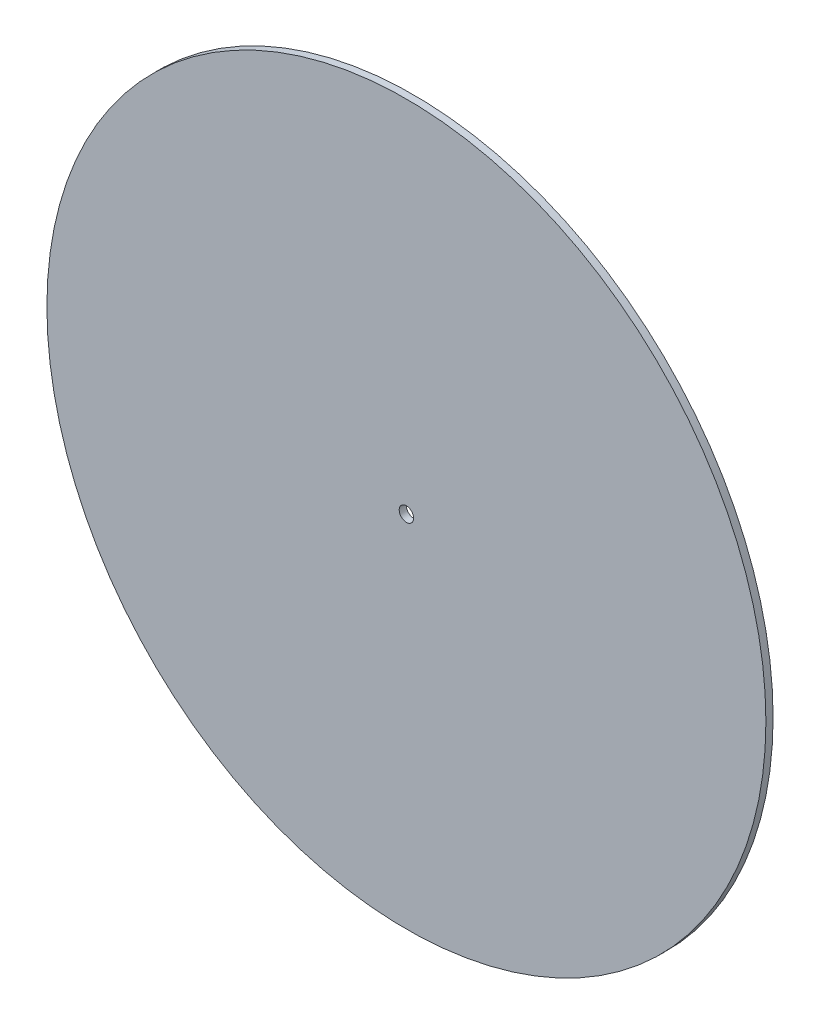
ISO-10303-21;
HEADER;
FILE_DESCRIPTION(('STEP AP214'),'2;1');
FILE_NAME('part.step','',(''),(''),'','','');
FILE_SCHEMA(('AUTOMOTIVE_DESIGN { 1 0 10303 214 1 1 1 1 }'));
ENDSEC;
DATA;
#1=APPLICATION_CONTEXT('core data for automotive mechanical design processes');
#2=APPLICATION_PROTOCOL_DEFINITION('international standard','automotive_design',2000,#1);
#3=PRODUCT_CONTEXT('',#1,'mechanical');
#4=PRODUCT('Part','Part','',(#3));
#5=PRODUCT_RELATED_PRODUCT_CATEGORY('part','',(#4));
#6=PRODUCT_DEFINITION_FORMATION('','',#4);
#7=PRODUCT_DEFINITION_CONTEXT('part definition',#1,'design');
#8=PRODUCT_DEFINITION('design','',#6,#7);
#9=PRODUCT_DEFINITION_SHAPE('','',#8);
#10=(LENGTH_UNIT() NAMED_UNIT(*) SI_UNIT(.MILLI.,.METRE.));
#11=(NAMED_UNIT(*) PLANE_ANGLE_UNIT() SI_UNIT($,.RADIAN.));
#12=(NAMED_UNIT(*) SI_UNIT($,.STERADIAN.) SOLID_ANGLE_UNIT());
#13=UNCERTAINTY_MEASURE_WITH_UNIT(LENGTH_MEASURE(1.E-05),#10,'distance_accuracy_value','');
#14=(GEOMETRIC_REPRESENTATION_CONTEXT(3) GLOBAL_UNCERTAINTY_ASSIGNED_CONTEXT((#13)) GLOBAL_UNIT_ASSIGNED_CONTEXT((#10,
#11,#12)) REPRESENTATION_CONTEXT('',''));
#15=CARTESIAN_POINT('',(0.,0.,0.));
#16=DIRECTION('',(0.,0.,1.));
#17=DIRECTION('',(1.,0.,0.));
#18=AXIS2_PLACEMENT_3D('',#15,#16,#17);
#19=CARTESIAN_POINT('',(0.,0.,2.));
#20=DIRECTION('',(0.,0.,1.));
#21=DIRECTION('',(1.,0.,0.));
#22=AXIS2_PLACEMENT_3D('',#19,#20,#21);
#23=PLANE('',#22);
#24=CARTESIAN_POINT('',(0.,0.,2.));
#25=DIRECTION('',(0.,0.,1.));
#26=DIRECTION('',(1.,0.,0.));
#27=AXIS2_PLACEMENT_3D('',#24,#25,#26);
#28=CIRCLE('',#27,100.);
#29=CARTESIAN_POINT('',(100.,0.,2.));
#30=VERTEX_POINT('',#29);
#31=EDGE_CURVE('E10',#30,#30,#28,.T.);
#32=ORIENTED_EDGE('',*,*,#31,.T.);
#33=EDGE_LOOP('',(#32));
#34=FACE_BOUND('',#33,.T.);
#35=CARTESIAN_POINT('',(0.,0.,2.));
#36=DIRECTION('',(0.,0.,1.));
#37=DIRECTION('',(1.,0.,0.));
#38=AXIS2_PLACEMENT_3D('',#35,#36,#37);
#39=CIRCLE('',#38,2.);
#40=CARTESIAN_POINT('',(2.,0.,2.));
#41=VERTEX_POINT('',#40);
#42=EDGE_CURVE('E52',#41,#41,#39,.T.);
#43=ORIENTED_EDGE('',*,*,#42,.F.);
#44=EDGE_LOOP('',(#43));
#45=FACE_BOUND('',#44,.T.);
#46=ADVANCED_FACE('F41',(#34,#45),#23,.T.);
#47=CARTESIAN_POINT('',(0.,0.,0.));
#48=DIRECTION('',(0.,0.,1.));
#49=DIRECTION('',(1.,0.,0.));
#50=AXIS2_PLACEMENT_3D('',#47,#48,#49);
#51=PLANE('',#50);
#52=CARTESIAN_POINT('',(0.,0.,0.));
#53=DIRECTION('',(0.,0.,1.));
#54=DIRECTION('',(1.,0.,0.));
#55=AXIS2_PLACEMENT_3D('',#52,#53,#54);
#56=CIRCLE('',#55,100.);
#57=CARTESIAN_POINT('',(100.,0.,0.));
#58=VERTEX_POINT('',#57);
#59=EDGE_CURVE('E45',#58,#58,#56,.T.);
#60=ORIENTED_EDGE('',*,*,#59,.F.);
#61=EDGE_LOOP('',(#60));
#62=FACE_BOUND('',#61,.T.);
#63=CARTESIAN_POINT('',(0.,0.,0.));
#64=DIRECTION('',(0.,0.,1.));
#65=DIRECTION('',(1.,0.,0.));
#66=AXIS2_PLACEMENT_3D('',#63,#64,#65);
#67=CIRCLE('',#66,2.);
#68=CARTESIAN_POINT('',(2.,0.,0.));
#69=VERTEX_POINT('',#68);
#70=EDGE_CURVE('E54',#69,#69,#67,.T.);
#71=ORIENTED_EDGE('',*,*,#70,.T.);
#72=EDGE_LOOP('',(#71));
#73=FACE_BOUND('',#72,.T.);
#74=ADVANCED_FACE('F64',(#62,#73),#51,.F.);
#75=CARTESIAN_POINT('',(0.,0.,2.));
#76=DIRECTION('',(0.,0.,-1.));
#77=DIRECTION('',(-1.,0.,0.));
#78=AXIS2_PLACEMENT_3D('',#75,#76,#77);
#79=CYLINDRICAL_SURFACE('',#78,100.);
#80=ORIENTED_EDGE('',*,*,#31,.F.);
#81=EDGE_LOOP('',(#80));
#82=FACE_BOUND('',#81,.T.);
#83=ORIENTED_EDGE('',*,*,#59,.T.);
#84=EDGE_LOOP('',(#83));
#85=FACE_BOUND('',#84,.T.);
#86=ADVANCED_FACE('F43',(#82,#85),#79,.T.);
#87=CARTESIAN_POINT('',(0.,0.,2.));
#88=DIRECTION('',(0.,0.,-1.));
#89=DIRECTION('',(-1.,0.,0.));
#90=AXIS2_PLACEMENT_3D('',#87,#88,#89);
#91=CYLINDRICAL_SURFACE('',#90,2.);
#92=ORIENTED_EDGE('',*,*,#42,.T.);
#93=EDGE_LOOP('',(#92));
#94=FACE_BOUND('',#93,.T.);
#95=ORIENTED_EDGE('',*,*,#70,.F.);
#96=EDGE_LOOP('',(#95));
#97=FACE_BOUND('',#96,.T.);
#98=ADVANCED_FACE('F60',(#94,#97),#91,.F.);
#99=CLOSED_SHELL('',(#46,#74,#86,#98));
#100=MANIFOLD_SOLID_BREP('B2',#99);
#101=ADVANCED_BREP_SHAPE_REPRESENTATION('',(#18,#100),#14);
#102=SHAPE_DEFINITION_REPRESENTATION(#9,#101);
ENDSEC;
END-ISO-10303-21;
